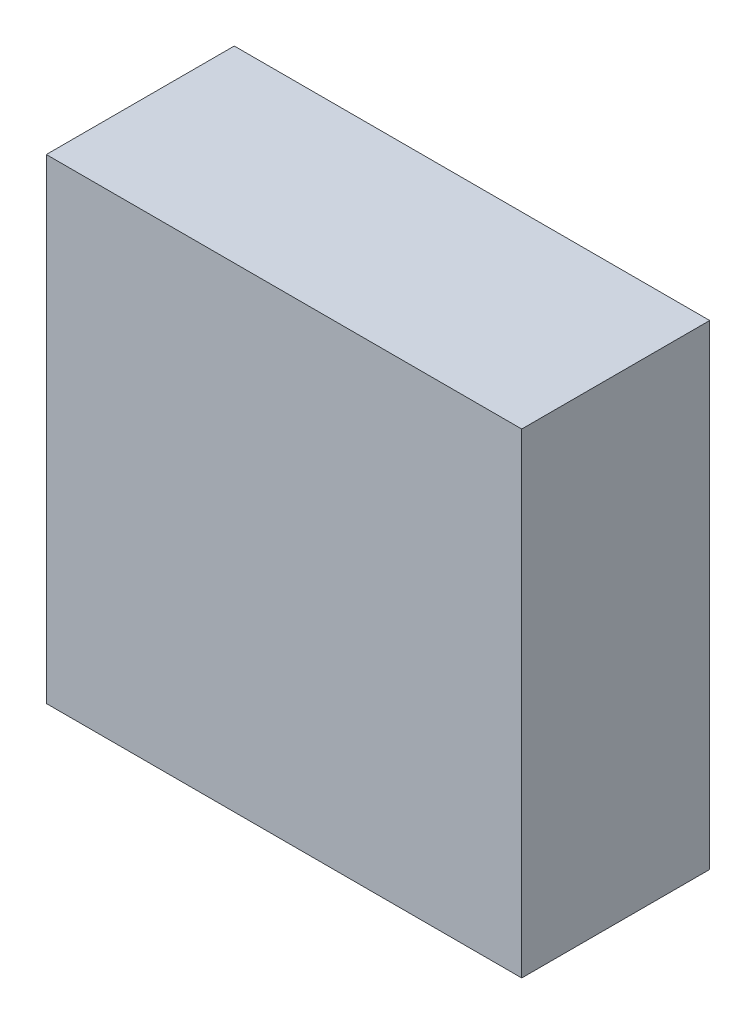
ISO-10303-21;
HEADER;
FILE_DESCRIPTION(('STEP AP214'),'2;1');
FILE_NAME('part.step','',(''),(''),'','','');
FILE_SCHEMA(('AUTOMOTIVE_DESIGN { 1 0 10303 214 1 1 1 1 }'));
ENDSEC;
DATA;
#1=APPLICATION_CONTEXT('core data for automotive mechanical design processes');
#2=APPLICATION_PROTOCOL_DEFINITION('international standard','automotive_design',2000,#1);
#3=PRODUCT_CONTEXT('',#1,'mechanical');
#4=PRODUCT('Part','Part','',(#3));
#5=PRODUCT_RELATED_PRODUCT_CATEGORY('part','',(#4));
#6=PRODUCT_DEFINITION_FORMATION('','',#4);
#7=PRODUCT_DEFINITION_CONTEXT('part definition',#1,'design');
#8=PRODUCT_DEFINITION('design','',#6,#7);
#9=PRODUCT_DEFINITION_SHAPE('','',#8);
#10=(LENGTH_UNIT() NAMED_UNIT(*) SI_UNIT(.MILLI.,.METRE.));
#11=(NAMED_UNIT(*) PLANE_ANGLE_UNIT() SI_UNIT($,.RADIAN.));
#12=(NAMED_UNIT(*) SI_UNIT($,.STERADIAN.) SOLID_ANGLE_UNIT());
#13=UNCERTAINTY_MEASURE_WITH_UNIT(LENGTH_MEASURE(1.E-05),#10,'distance_accuracy_value','');
#14=(GEOMETRIC_REPRESENTATION_CONTEXT(3) GLOBAL_UNCERTAINTY_ASSIGNED_CONTEXT((#13)) GLOBAL_UNIT_ASSIGNED_CONTEXT((#10,
#11,#12)) REPRESENTATION_CONTEXT('',''));
#15=CARTESIAN_POINT('',(0.,0.,0.));
#16=DIRECTION('',(0.,0.,1.));
#17=DIRECTION('',(1.,0.,0.));
#18=AXIS2_PLACEMENT_3D('',#15,#16,#17);
#19=CARTESIAN_POINT('',(-21.5,-21.5,-17.));
#20=DIRECTION('',(-1.,0.,0.));
#21=DIRECTION('',(0.,0.,1.));
#22=AXIS2_PLACEMENT_3D('',#19,#20,#21);
#23=PLANE('',#22);
#24=DIRECTION('',(0.,-1.,0.));
#25=VECTOR('',#24,1.);
#26=CARTESIAN_POINT('',(-21.5,-21.5,0.));
#27=LINE('',#26,#25);
#28=CARTESIAN_POINT('',(-21.5,21.5,0.));
#29=VERTEX_POINT('',#28);
#30=CARTESIAN_POINT('',(-21.5,-21.5,0.));
#31=VERTEX_POINT('',#30);
#32=EDGE_CURVE('E99',#29,#31,#27,.T.);
#33=ORIENTED_EDGE('',*,*,#32,.F.);
#34=DIRECTION('',(0.,0.,1.));
#35=VECTOR('',#34,1.);
#36=CARTESIAN_POINT('',(-21.5,21.5,-17.));
#37=LINE('',#36,#35);
#38=CARTESIAN_POINT('',(-21.5,21.5,-17.));
#39=VERTEX_POINT('',#38);
#40=EDGE_CURVE('E11',#39,#29,#37,.T.);
#41=ORIENTED_EDGE('',*,*,#40,.F.);
#42=DIRECTION('',(0.,-1.,0.));
#43=VECTOR('',#42,1.);
#44=CARTESIAN_POINT('',(-21.5,-21.5,-17.));
#45=LINE('',#44,#43);
#46=CARTESIAN_POINT('',(-21.5,-21.5,-17.));
#47=VERTEX_POINT('',#46);
#48=EDGE_CURVE('E93',#39,#47,#45,.T.);
#49=ORIENTED_EDGE('',*,*,#48,.T.);
#50=DIRECTION('',(0.,0.,1.));
#51=VECTOR('',#50,1.);
#52=CARTESIAN_POINT('',(-21.5,-21.5,-17.));
#53=LINE('',#52,#51);
#54=EDGE_CURVE('E38',#47,#31,#53,.T.);
#55=ORIENTED_EDGE('',*,*,#54,.T.);
#56=EDGE_LOOP('',(#33,#41,#49,#55));
#57=FACE_BOUND('',#56,.T.);
#58=ADVANCED_FACE('F35',(#57),#23,.T.);
#59=CARTESIAN_POINT('',(21.5,21.5,-17.));
#60=DIRECTION('',(0.,1.,0.));
#61=DIRECTION('',(-1.,0.,0.));
#62=AXIS2_PLACEMENT_3D('',#59,#60,#61);
#63=PLANE('',#62);
#64=DIRECTION('',(-1.,0.,0.));
#65=VECTOR('',#64,1.);
#66=CARTESIAN_POINT('',(21.5,21.5,0.));
#67=LINE('',#66,#65);
#68=CARTESIAN_POINT('',(21.5,21.5,0.));
#69=VERTEX_POINT('',#68);
#70=EDGE_CURVE('E95',#69,#29,#67,.T.);
#71=ORIENTED_EDGE('',*,*,#70,.F.);
#72=DIRECTION('',(0.,0.,1.));
#73=VECTOR('',#72,1.);
#74=CARTESIAN_POINT('',(21.5,21.5,-17.));
#75=LINE('',#74,#73);
#76=CARTESIAN_POINT('',(21.5,21.5,-17.));
#77=VERTEX_POINT('',#76);
#78=EDGE_CURVE('E44',#77,#69,#75,.T.);
#79=ORIENTED_EDGE('',*,*,#78,.F.);
#80=DIRECTION('',(-1.,0.,0.));
#81=VECTOR('',#80,1.);
#82=CARTESIAN_POINT('',(21.5,21.5,-17.));
#83=LINE('',#82,#81);
#84=EDGE_CURVE('E90',#77,#39,#83,.T.);
#85=ORIENTED_EDGE('',*,*,#84,.T.);
#86=ORIENTED_EDGE('',*,*,#40,.T.);
#87=EDGE_LOOP('',(#71,#79,#85,#86));
#88=FACE_BOUND('',#87,.T.);
#89=ADVANCED_FACE('F109',(#88),#63,.T.);
#90=CARTESIAN_POINT('',(21.5,-21.5,-17.));
#91=DIRECTION('',(1.,0.,0.));
#92=DIRECTION('',(0.,0.,-1.));
#93=AXIS2_PLACEMENT_3D('',#90,#91,#92);
#94=PLANE('',#93);
#95=DIRECTION('',(0.,1.,0.));
#96=VECTOR('',#95,1.);
#97=CARTESIAN_POINT('',(21.5,-21.5,0.));
#98=LINE('',#97,#96);
#99=CARTESIAN_POINT('',(21.5,-21.5,0.));
#100=VERTEX_POINT('',#99);
#101=EDGE_CURVE('E85',#100,#69,#98,.T.);
#102=ORIENTED_EDGE('',*,*,#101,.F.);
#103=DIRECTION('',(0.,0.,1.));
#104=VECTOR('',#103,1.);
#105=CARTESIAN_POINT('',(21.5,-21.5,-17.));
#106=LINE('',#105,#104);
#107=CARTESIAN_POINT('',(21.5,-21.5,-17.));
#108=VERTEX_POINT('',#107);
#109=EDGE_CURVE('E80',#108,#100,#106,.T.);
#110=ORIENTED_EDGE('',*,*,#109,.F.);
#111=DIRECTION('',(0.,1.,0.));
#112=VECTOR('',#111,1.);
#113=CARTESIAN_POINT('',(21.5,-21.5,-17.));
#114=LINE('',#113,#112);
#115=EDGE_CURVE('E83',#108,#77,#114,.T.);
#116=ORIENTED_EDGE('',*,*,#115,.T.);
#117=ORIENTED_EDGE('',*,*,#78,.T.);
#118=EDGE_LOOP('',(#102,#110,#116,#117));
#119=FACE_BOUND('',#118,.T.);
#120=ADVANCED_FACE('F82',(#119),#94,.T.);
#121=CARTESIAN_POINT('',(21.5,-21.5,-17.));
#122=DIRECTION('',(0.,-1.,0.));
#123=DIRECTION('',(1.,0.,0.));
#124=AXIS2_PLACEMENT_3D('',#121,#122,#123);
#125=PLANE('',#124);
#126=DIRECTION('',(1.,0.,0.));
#127=VECTOR('',#126,1.);
#128=CARTESIAN_POINT('',(21.5,-21.5,0.));
#129=LINE('',#128,#127);
#130=EDGE_CURVE('E102',#31,#100,#129,.T.);
#131=ORIENTED_EDGE('',*,*,#130,.F.);
#132=ORIENTED_EDGE('',*,*,#54,.F.);
#133=DIRECTION('',(1.,0.,0.));
#134=VECTOR('',#133,1.);
#135=CARTESIAN_POINT('',(21.5,-21.5,-17.));
#136=LINE('',#135,#134);
#137=EDGE_CURVE('E89',#47,#108,#136,.T.);
#138=ORIENTED_EDGE('',*,*,#137,.T.);
#139=ORIENTED_EDGE('',*,*,#109,.T.);
#140=EDGE_LOOP('',(#131,#132,#138,#139));
#141=FACE_BOUND('',#140,.T.);
#142=ADVANCED_FACE('F92',(#141),#125,.T.);
#143=CARTESIAN_POINT('',(0.,0.,-17.));
#144=DIRECTION('',(0.,0.,1.));
#145=DIRECTION('',(1.,0.,0.));
#146=AXIS2_PLACEMENT_3D('',#143,#144,#145);
#147=PLANE('',#146);
#148=ORIENTED_EDGE('',*,*,#48,.F.);
#149=ORIENTED_EDGE('',*,*,#84,.F.);
#150=ORIENTED_EDGE('',*,*,#115,.F.);
#151=ORIENTED_EDGE('',*,*,#137,.F.);
#152=EDGE_LOOP('',(#148,#149,#150,#151));
#153=FACE_BOUND('',#152,.T.);
#154=ADVANCED_FACE('F88',(#153),#147,.F.);
#155=CARTESIAN_POINT('',(0.,0.,0.));
#156=DIRECTION('',(0.,0.,1.));
#157=DIRECTION('',(1.,0.,0.));
#158=AXIS2_PLACEMENT_3D('',#155,#156,#157);
#159=PLANE('',#158);
#160=ORIENTED_EDGE('',*,*,#32,.T.);
#161=ORIENTED_EDGE('',*,*,#130,.T.);
#162=ORIENTED_EDGE('',*,*,#101,.T.);
#163=ORIENTED_EDGE('',*,*,#70,.T.);
#164=EDGE_LOOP('',(#160,#161,#162,#163));
#165=FACE_BOUND('',#164,.T.);
#166=ADVANCED_FACE('F108',(#165),#159,.T.);
#167=CLOSED_SHELL('',(#58,#89,#120,#142,#154,#166));
#168=MANIFOLD_SOLID_BREP('B2',#167);
#169=ADVANCED_BREP_SHAPE_REPRESENTATION('',(#18,#168),#14);
#170=SHAPE_DEFINITION_REPRESENTATION(#9,#169);
ENDSEC;
END-ISO-10303-21;
